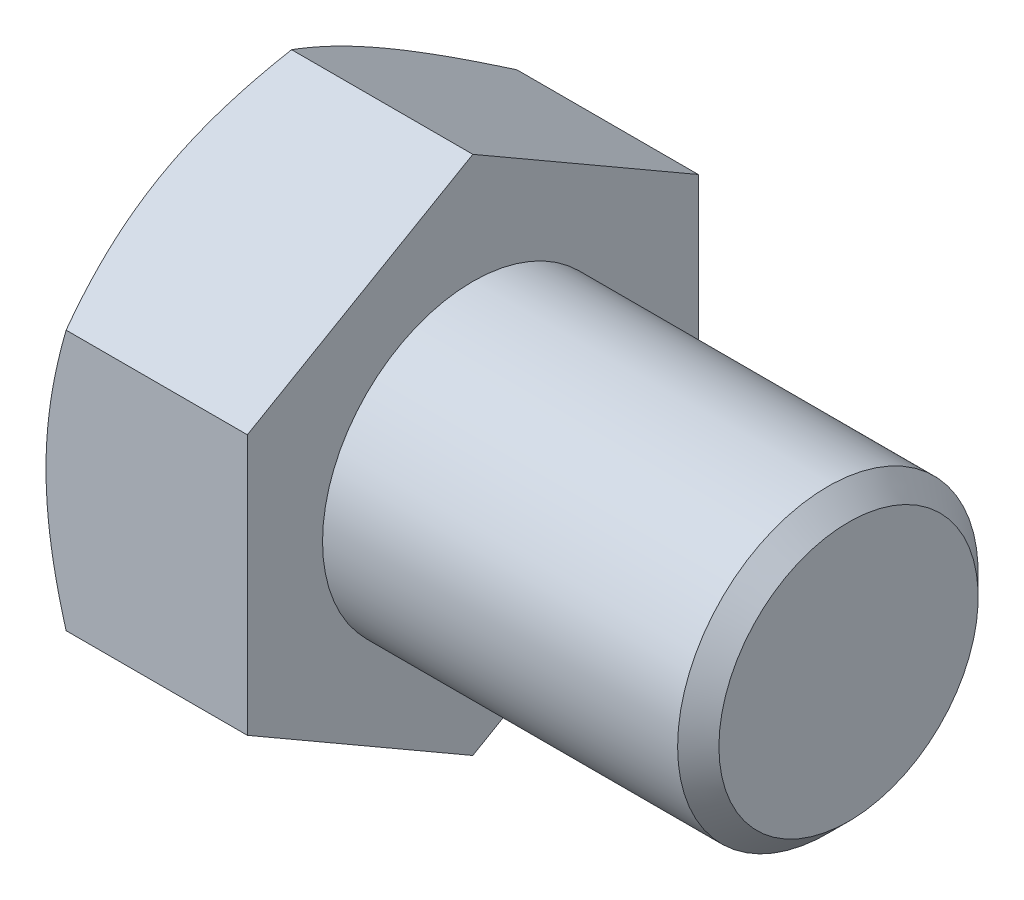
ISO-10303-21;
HEADER;
FILE_DESCRIPTION(('STEP AP214'),'2;1');
FILE_NAME('part.step','',(''),(''),'','','');
FILE_SCHEMA(('AUTOMOTIVE_DESIGN { 1 0 10303 214 1 1 1 1 }'));
ENDSEC;
DATA;
#1=APPLICATION_CONTEXT('core data for automotive mechanical design processes');
#2=APPLICATION_PROTOCOL_DEFINITION('international standard','automotive_design',2000,#1);
#3=PRODUCT_CONTEXT('',#1,'mechanical');
#4=PRODUCT('Part','Part','',(#3));
#5=PRODUCT_RELATED_PRODUCT_CATEGORY('part','',(#4));
#6=PRODUCT_DEFINITION_FORMATION('','',#4);
#7=PRODUCT_DEFINITION_CONTEXT('part definition',#1,'design');
#8=PRODUCT_DEFINITION('design','',#6,#7);
#9=PRODUCT_DEFINITION_SHAPE('','',#8);
#10=(LENGTH_UNIT() NAMED_UNIT(*) SI_UNIT(.MILLI.,.METRE.));
#11=(NAMED_UNIT(*) PLANE_ANGLE_UNIT() SI_UNIT($,.RADIAN.));
#12=(NAMED_UNIT(*) SI_UNIT($,.STERADIAN.) SOLID_ANGLE_UNIT());
#13=UNCERTAINTY_MEASURE_WITH_UNIT(LENGTH_MEASURE(1.E-05),#10,'distance_accuracy_value','');
#14=(GEOMETRIC_REPRESENTATION_CONTEXT(3) GLOBAL_UNCERTAINTY_ASSIGNED_CONTEXT((#13)) GLOBAL_UNIT_ASSIGNED_CONTEXT((#10,
#11,#12)) REPRESENTATION_CONTEXT('',''));
#15=CARTESIAN_POINT('',(0.,0.,0.));
#16=DIRECTION('',(0.,0.,1.));
#17=DIRECTION('',(1.,0.,0.));
#18=AXIS2_PLACEMENT_3D('',#15,#16,#17);
#19=CARTESIAN_POINT('',(13.3999999999959,8.66025403784447,-15.0000000000012));
#20=DIRECTION('',(0.,-0.866025403784436,0.500000000000001));
#21=DIRECTION('',(0.,-0.500000000000001,-0.866025403784436));
#22=AXIS2_PLACEMENT_3D('',#19,#20,#21);
#23=PLANE('',#22);
#24=CARTESIAN_POINT('',(1.33981262949145,17.3206235457429,0.00019999999800735));
#25=CARTESIAN_POINT('',(1.22992178974495,17.1302745659133,-0.329494104235164));
#26=CARTESIAN_POINT('',(1.12501758932902,16.9391831227823,-0.660474192629355));
#27=CARTESIAN_POINT('',(0.926568581943113,16.5554679079495,-1.32508844035675));
#28=CARTESIAN_POINT('',(0.833027511049702,16.3628436543365,-1.65872343438453));
#29=CARTESIAN_POINT('',(0.658562147610224,15.9756905506628,-2.32929228025546));
#30=CARTESIAN_POINT('',(0.577667706602513,15.7811583127516,-2.66623200002775));
#31=CARTESIAN_POINT('',(0.430232643422329,15.3907420734257,-3.34245276264016));
#32=CARTESIAN_POINT('',(0.36369120238161,15.1948581497858,-3.68173367077032));
#33=CARTESIAN_POINT('',(0.247792374696675,14.8067578304071,-4.35394314236808));
#34=CARTESIAN_POINT('',(0.198051383437111,14.6145702475693,-4.68682180042704));
#35=CARTESIAN_POINT('',(0.114646749003904,14.229314441666,-5.35410443016227));
#36=CARTESIAN_POINT('',(0.0809834152901584,14.0362462017221,-5.68850843107301));
#37=CARTESIAN_POINT('',(0.0305840757088134,13.6497853945799,-6.3578781841776));
#38=CARTESIAN_POINT('',(0.0138279549596573,13.4563934876208,-6.69284279280379));
#39=CARTESIAN_POINT('',(-0.00239660617380265,13.0694311550729,-7.36308121339096));
#40=CARTESIAN_POINT('',(-0.00186558073162809,12.8758607351851,-7.69835501547773));
#41=CARTESIAN_POINT('',(0.0152766129945827,12.5139822792561,-8.32514688731148));
#42=CARTESIAN_POINT('',(0.0297968460483135,12.3456484541483,-8.6167096250319));
#43=CARTESIAN_POINT('',(0.0716371404238038,12.0093680110874,-9.1991644380061));
#44=CARTESIAN_POINT('',(0.0989581071100801,11.841421421367,-9.49005646435947));
#45=CARTESIAN_POINT('',(0.165923511998926,11.5060066717832,-10.0710118522462));
#46=CARTESIAN_POINT('',(0.205578128270891,11.338539022768,-10.3610743289648));
#47=CARTESIAN_POINT('',(0.296515103018264,11.0043888432053,-10.9398394173258));
#48=CARTESIAN_POINT('',(0.347798251969543,10.8377063668183,-11.2285419351594));
#49=CARTESIAN_POINT('',(0.520386864747446,10.3317324659538,-12.1049144387605));
#50=CARTESIAN_POINT('',(0.658901178257684,9.9939062555909,-12.6900465992375));
#51=CARTESIAN_POINT('',(0.973271968475243,9.32329122184555,-13.851585910004));
#52=CARTESIAN_POINT('',(1.14905461461676,8.99049381241429,-14.4280079317664));
#53=CARTESIAN_POINT('',(1.33981262948479,8.6601385677906,-15.0002000000018));
#54=B_SPLINE_CURVE_WITH_KNOTS('',3,(#24,#25,#26,#27,#28,#29,#30,#31,#32,#33,#34,#35,#36,#37,#38,
#39,#40,#41,#42,#43,#44,#45,#46,#47,#48,#49,#50,#51,#52,#53),.UNSPECIFIED.,.F.,.F.,(4,2,2,2,2,2,
2,2,2,2,2,2,2,2,4),(0.,1.18875411504131,2.377898028,3.56980778300347,4.76164951910096,
5.92407379683694,7.08652044780734,8.24758247405967,9.40860862348214,10.4193068498549,
11.4300765712295,12.4416826308638,13.4533574773395,15.5211962051179,17.5849760846236),.UNSPECIFIED.);
#55=CARTESIAN_POINT('',(1.33974596215847,17.3205080756889,-1.60982338570648E-12));
#56=VERTEX_POINT('',#55);
#57=CARTESIAN_POINT('',(-3.99680288865056E-12,12.9903810567665,-7.50000000000012));
#58=VERTEX_POINT('',#57);
#59=EDGE_CURVE('E62',#56,#58,#54,.T.);
#60=ORIENTED_EDGE('',*,*,#59,.F.);
#61=DIRECTION('',(-1.,0.,0.));
#62=VECTOR('',#61,1.);
#63=CARTESIAN_POINT('',(13.4000000000025,17.320508075689,-1.0547118733939E-12));
#64=LINE('',#63,#62);
#65=CARTESIAN_POINT('',(13.4000000000025,17.320508075689,-1.0547118733939E-12));
#66=VERTEX_POINT('',#65);
#67=EDGE_CURVE('E158',#66,#56,#64,.T.);
#68=ORIENTED_EDGE('',*,*,#67,.F.);
#69=DIRECTION('',(0.,0.500000000000001,0.866025403784436));
#70=VECTOR('',#69,1.);
#71=CARTESIAN_POINT('',(13.3999999999959,8.66025403784447,-15.0000000000012));
#72=LINE('',#71,#70);
#73=CARTESIAN_POINT('',(13.3999999999959,8.66025403784447,-15.0000000000012));
#74=VERTEX_POINT('',#73);
#75=EDGE_CURVE('E249',#74,#66,#72,.T.);
#76=ORIENTED_EDGE('',*,*,#75,.F.);
#77=DIRECTION('',(-1.,0.,0.));
#78=VECTOR('',#77,1.);
#79=CARTESIAN_POINT('',(13.3999999999959,8.66025403784447,-15.0000000000012));
#80=LINE('',#79,#78);
#81=CARTESIAN_POINT('',(1.33974596215181,8.66025403784453,-15.0000000000015));
#82=VERTEX_POINT('',#81);
#83=EDGE_CURVE('E146',#74,#82,#80,.T.);
#84=ORIENTED_EDGE('',*,*,#83,.T.);
#85=EDGE_CURVE('E140',#58,#82,#54,.T.);
#86=ORIENTED_EDGE('',*,*,#85,.F.);
#87=EDGE_LOOP('',(#60,#68,#76,#84,#86));
#88=FACE_BOUND('',#87,.T.);
#89=ADVANCED_FACE('F46',(#88),#23,.F.);
#90=CARTESIAN_POINT('',(13.4000000000025,17.320508075689,-1.0547118733939E-12));
#91=DIRECTION('',(0.,-0.866025403784438,-0.500000000000001));
#92=DIRECTION('',(0.,0.500000000000001,-0.866025403784438));
#93=AXIS2_PLACEMENT_3D('',#90,#91,#92);
#94=PLANE('',#93);
#95=CARTESIAN_POINT('',(1.33981262948879,8.66013856779067,15.0001999999982));
#96=CARTESIAN_POINT('',(1.22992178974352,8.85048754762046,14.6705058957646));
#97=CARTESIAN_POINT('',(1.12501758932809,9.04157899075148,14.3395258073703));
#98=CARTESIAN_POINT('',(0.926568581942536,9.42529420558436,13.6749115596427));
#99=CARTESIAN_POINT('',(0.833027511048978,9.61791845919735,13.3412765656149));
#100=CARTESIAN_POINT('',(0.658562147609391,10.0050715628711,12.6707077197439));
#101=CARTESIAN_POINT('',(0.577667706601716,10.1996038007823,12.3337679999716));
#102=CARTESIAN_POINT('',(0.430232643421567,10.5900200401083,11.6575472373591));
#103=CARTESIAN_POINT('',(0.363691202380847,10.7859039637481,11.3182663292289));
#104=CARTESIAN_POINT('',(0.247792374695915,11.1740042831269,10.6460568576312));
#105=CARTESIAN_POINT('',(0.198051383436355,11.3661918659648,10.3131781995722));
#106=CARTESIAN_POINT('',(0.114646749003198,11.751447671868,9.64589556983693));
#107=CARTESIAN_POINT('',(0.0809834152894975,11.9445159118119,9.31149156892617));
#108=CARTESIAN_POINT('',(0.0305840757080926,12.3309767189542,8.64212181582161));
#109=CARTESIAN_POINT('',(0.0138279549588316,12.5243686259134,8.30715720719547));
#110=CARTESIAN_POINT('',(-0.0023966061742602,12.911330958461,7.63691878660807));
#111=CARTESIAN_POINT('',(-0.00186558073161222,13.1049013783484,7.30164498452102));
#112=CARTESIAN_POINT('',(0.0152766129945689,13.4667798342774,6.67485311268725));
#113=CARTESIAN_POINT('',(0.0297968460479151,13.6351136593857,6.38329037496703));
#114=CARTESIAN_POINT('',(0.0716371404231525,13.9713941024469,5.80083556199295));
#115=CARTESIAN_POINT('',(0.09895810710956,14.1393406921672,5.50994353563951));
#116=CARTESIAN_POINT('',(0.165923511998519,14.4747554417509,4.9289881477527));
#117=CARTESIAN_POINT('',(0.205578128270465,14.6422230907662,4.6389256710341));
#118=CARTESIAN_POINT('',(0.296515103017885,14.9763732703289,4.06016058267315));
#119=CARTESIAN_POINT('',(0.347798251969229,15.1430557467158,3.7714580648396));
#120=CARTESIAN_POINT('',(0.520386864747046,15.6490296475804,2.89508556123841));
#121=CARTESIAN_POINT('',(0.658901178256827,15.9868558579434,2.30995340076128));
#122=CARTESIAN_POINT('',(0.973271968475716,16.6574708916886,1.14841408999487));
#123=CARTESIAN_POINT('',(1.14905461461902,16.9902683011197,0.571992068232795));
#124=CARTESIAN_POINT('',(1.33981262949145,17.3206235457429,-0.000200000001671086));
#125=B_SPLINE_CURVE_WITH_KNOTS('',3,(#95,#96,#97,#98,#99,#100,#101,#102,#103,#104,#105,#106,
#107,#108,#109,#110,#111,#112,#113,#114,#115,#116,#117,#118,#119,#120,#121,#122,#123,#124),
.UNSPECIFIED.,.F.,.F.,(4,2,2,2,2,2,2,2,2,2,2,2,2,2,4),(0.,1.18875411504146,2.3778980280003,
3.56980778300386,4.76164951910144,5.92407379683745,7.08652044780786,8.24758247406025,
9.4086086234828,10.4193068498556,11.4300765712303,12.4416826308645,13.4533574773402,
15.5211962051188,17.5849760846249),.UNSPECIFIED.);
#126=CARTESIAN_POINT('',(1.3397459621558,8.66025403784458,14.9999999999984));
#127=VERTEX_POINT('',#126);
#128=CARTESIAN_POINT('',(0.,12.9903810567665,7.49999999999973));
#129=VERTEX_POINT('',#128);
#130=EDGE_CURVE('E69',#127,#129,#125,.T.);
#131=ORIENTED_EDGE('',*,*,#130,.F.);
#132=DIRECTION('',(-1.,0.,0.));
#133=VECTOR('',#132,1.);
#134=CARTESIAN_POINT('',(13.3999999999999,8.66025403784466,14.9999999999993));
#135=LINE('',#134,#133);
#136=CARTESIAN_POINT('',(13.3999999999999,8.66025403784466,14.9999999999993));
#137=VERTEX_POINT('',#136);
#138=EDGE_CURVE('E156',#137,#127,#135,.T.);
#139=ORIENTED_EDGE('',*,*,#138,.F.);
#140=DIRECTION('',(0.,-0.500000000000001,0.866025403784438));
#141=VECTOR('',#140,1.);
#142=CARTESIAN_POINT('',(13.4000000000025,17.320508075689,-1.0547118733939E-12));
#143=LINE('',#142,#141);
#144=EDGE_CURVE('E247',#66,#137,#143,.T.);
#145=ORIENTED_EDGE('',*,*,#144,.F.);
#146=ORIENTED_EDGE('',*,*,#67,.T.);
#147=EDGE_CURVE('E173',#129,#56,#125,.T.);
#148=ORIENTED_EDGE('',*,*,#147,.F.);
#149=EDGE_LOOP('',(#131,#139,#145,#146,#148));
#150=FACE_BOUND('',#149,.T.);
#151=ADVANCED_FACE('F179',(#150),#94,.F.);
#152=CARTESIAN_POINT('',(13.3999999999999,8.66025403784466,14.9999999999993));
#153=DIRECTION('',(0.,0.,-1.));
#154=DIRECTION('',(-1.,0.,0.));
#155=AXIS2_PLACEMENT_3D('',#152,#153,#154);
#156=PLANE('',#155);
#157=CARTESIAN_POINT('',(7.37312634053033,-23.3710902414275,14.9999999999986));
#158=CARTESIAN_POINT('',(7.2137526215236,-23.0430760678899,14.999999999999));
#159=CARTESIAN_POINT('',(7.05516543980331,-22.7146799160127,14.9999999999992));
#160=CARTESIAN_POINT('',(6.73974206910379,-22.05704398432,14.9999999999994));
#161=CARTESIAN_POINT('',(6.58290589740235,-21.7278041962194,14.9999999999993));
#162=CARTESIAN_POINT('',(6.11525014240026,-20.7386136963535,14.9999999999992));
#163=CARTESIAN_POINT('',(5.80732977355088,-20.0772871992665,14.9999999999993));
#164=CARTESIAN_POINT('',(5.19942692960361,-18.7466975896985,14.9999999999993));
#165=CARTESIAN_POINT('',(4.89949586067152,-18.0774109356538,14.9999999999993));
#166=CARTESIAN_POINT('',(4.3117582823937,-16.7335531318988,14.9999999999993));
#167=CARTESIAN_POINT('',(4.02395120754568,-16.0589822304074,14.9999999999993));
#168=CARTESIAN_POINT('',(3.45448123485085,-14.6812618339694,14.9999999999993));
#169=CARTESIAN_POINT('',(3.17332879633735,-13.9779002509552,14.9999999999993));
#170=CARTESIAN_POINT('',(2.63203971808663,-12.5629833856314,14.9999999999993));
#171=CARTESIAN_POINT('',(2.37190542191437,-11.8514271996858,14.9999999999994));
#172=CARTESIAN_POINT('',(1.87940642767847,-10.4203092774281,14.9999999999992));
#173=CARTESIAN_POINT('',(1.64698643343642,-9.70076672295575,14.9999999999988));
#174=CARTESIAN_POINT('',(1.21728875041617,-8.25129237856194,14.9999999999998));
#175=CARTESIAN_POINT('',(1.02000010663817,-7.52136390422092,15.000000000001));
#176=CARTESIAN_POINT('',(0.758044011051221,-6.42057854312759,15.0000000000003));
#177=CARTESIAN_POINT('',(0.676568269150707,-6.05369801817304,14.9999999999996));
#178=CARTESIAN_POINT('',(0.525901265984167,-5.31741005067913,14.999999999999));
#179=CARTESIAN_POINT('',(0.456709757583278,-4.94800265913072,14.9999999999992));
#180=CARTESIAN_POINT('',(0.331825651240384,-4.20690684288065,14.9999999999994));
#181=CARTESIAN_POINT('',(0.276132866036205,-3.83521844989572,14.9999999999993));
#182=CARTESIAN_POINT('',(0.179353464527608,-3.08994807492367,14.9999999999993));
#183=CARTESIAN_POINT('',(0.138266210271655,-2.71636617636563,14.9999999999993));
#184=CARTESIAN_POINT('',(0.0720349282965913,-1.97275308863384,14.9999999999993));
#185=CARTESIAN_POINT('',(0.0466876247898137,-1.60274011631211,14.9999999999993));
#186=CARTESIAN_POINT('',(0.0116690165589467,-0.861974179459193,14.9999999999993));
#187=CARTESIAN_POINT('',(0.00199744875057519,-0.491221227451583,14.9999999999993));
#188=CARTESIAN_POINT('',(-0.00143922526280585,0.250361887880328,14.9999999999992));
#189=CARTESIAN_POINT('',(0.00479570856969709,0.621192051396623,14.9999999999991));
#190=CARTESIAN_POINT('',(0.0330186069485821,1.36225664168384,14.9999999999995));
#191=CARTESIAN_POINT('',(0.0550072762400003,1.73249104106054,15.));
#192=CARTESIAN_POINT('',(0.126051291967395,2.61901692241343,15.0000000000003));
#193=CARTESIAN_POINT('',(0.182399811188253,3.13473445335257,14.9999999999996));
#194=CARTESIAN_POINT('',(0.322620708609686,4.16241630599156,14.999999999999));
#195=CARTESIAN_POINT('',(0.406496739203871,4.67438012042198,14.9999999999992));
#196=CARTESIAN_POINT('',(0.598789077162155,5.69404144057643,14.9999999999994));
#197=CARTESIAN_POINT('',(0.70722421073915,6.20173536185491,14.9999999999993));
#198=CARTESIAN_POINT('',(0.945319561804376,7.2120668323238,14.9999999999993));
#199=CARTESIAN_POINT('',(1.07497948282535,7.7147044520364,14.9999999999993));
#200=CARTESIAN_POINT('',(1.35544197251151,8.72602999971862,14.9999999999993));
#201=CARTESIAN_POINT('',(1.50664978204951,9.23460476162545,14.9999999999993));
#202=CARTESIAN_POINT('',(1.82490436710128,10.2467458696593,14.9999999999993));
#203=CARTESIAN_POINT('',(1.99195124812721,10.7503121823977,14.9999999999992));
#204=CARTESIAN_POINT('',(2.33921280433556,11.7526813548355,14.9999999999994));
#205=CARTESIAN_POINT('',(2.51942324274063,12.2514856892744,14.9999999999995));
#206=CARTESIAN_POINT('',(2.89087066917173,13.2449469437037,14.9999999999991));
#207=CARTESIAN_POINT('',(3.08210752155896,13.7396039146263,14.9999999999985));
#208=CARTESIAN_POINT('',(3.54947439299904,14.9157121538862,14.9999999999982));
#209=CARTESIAN_POINT('',(3.82985053968005,15.5954736257746,14.999999999999));
#210=CARTESIAN_POINT('',(4.40448813553263,16.9491200475868,14.9999999999996));
#211=CARTESIAN_POINT('',(4.69875048752325,17.6230046120362,14.9999999999994));
#212=CARTESIAN_POINT('',(5.2983523129537,18.9660045563959,14.9999999999992));
#213=CARTESIAN_POINT('',(5.60369438024245,19.6351187750887,14.9999999999993));
#214=CARTESIAN_POINT('',(6.22319663096821,20.9692236108892,14.9999999999993));
#215=CARTESIAN_POINT('',(6.53735661507852,21.6342143207936,14.9999999999993));
#216=CARTESIAN_POINT('',(7.17319119707159,22.9615174098263,14.9999999999993));
#217=CARTESIAN_POINT('',(7.4948739360652,23.6238258820834,14.9999999999993));
#218=CARTESIAN_POINT('',(8.14411318318141,24.9455571746817,14.9999999999993));
#219=CARTESIAN_POINT('',(8.47166971805678,25.6049799818627,14.9999999999993));
#220=CARTESIAN_POINT('',(9.13159579124988,26.9212980535411,14.9999999999993));
#221=CARTESIAN_POINT('',(9.46396466906465,27.5781936495281,14.9999999999993));
#222=CARTESIAN_POINT('',(10.1327647289833,28.8899147664244,14.9999999999993));
#223=CARTESIAN_POINT('',(10.4691959273164,29.5447402790504,14.9999999999993));
#224=CARTESIAN_POINT('',(11.4259204894654,31.3950227179767,14.9999999999993));
#225=CARTESIAN_POINT('',(12.0502117945664,32.5884123624247,14.9999999999993));
#226=CARTESIAN_POINT('',(13.3073006196974,34.970749109484,14.9999999999993));
#227=CARTESIAN_POINT('',(13.9400984560095,36.1596960447985,14.9999999999993));
#228=CARTESIAN_POINT('',(15.2105565660844,38.531046356627,14.9999999999993));
#229=CARTESIAN_POINT('',(15.8482001148671,39.713458699775,14.9999999999993));
#230=CARTESIAN_POINT('',(16.8084387500316,41.4849860590732,14.9999999999993));
#231=CARTESIAN_POINT('',(17.129138143899,42.0751301506575,14.9999999999993));
#232=CARTESIAN_POINT('',(17.7716684878245,43.2548008777467,14.9999999999993));
#233=CARTESIAN_POINT('',(18.0934994361267,43.844327514208,14.9999999999994));
#234=CARTESIAN_POINT('',(18.4158306344155,44.4335805842629,14.9999999999996));
#235=B_SPLINE_CURVE_WITH_KNOTS('',3,(#157,#158,#159,#160,#161,#162,#163,#164,#165,#166,#167,
#168,#169,#170,#171,#172,#173,#174,#175,#176,#177,#178,#179,#180,#181,#182,#183,#184,#185,#186,
#187,#188,#189,#190,#191,#192,#193,#194,#195,#196,#197,#198,#199,#200,#201,#202,#203,#204,#205,
#206,#207,#208,#209,#210,#211,#212,#213,#214,#215,#216,#217,#218,#219,#220,#221,#222,#223,#224,
#225,#226,#227,#228,#229,#230,#231,#232,#233,#234),.UNSPECIFIED.,.F.,.F.,(4,2,2,2,2,2,2,2,2,2,2,
2,2,2,2,2,2,2,2,2,2,2,2,2,2,2,2,2,2,2,2,2,2,2,2,2,2,2,4),(0.,1.09404536545603,2.18810151669502,
4.37653199497436,6.57669491913782,8.77675510670035,11.0489153517506,13.3213285985884,
15.5891291968648,17.8562213843684,18.9835047903021,20.110765514918,21.2380106006194,
22.3652064435975,23.4775244969856,24.5898238822594,25.7021260672527,26.8144780143102,
28.3699800813119,29.9256886182745,31.482593771755,33.0394771802814,34.6309007054006,
36.2223348325514,37.8132589841612,39.4041635695719,41.6098943752715,43.8157687858481,
46.0221629836906,48.228507346673,50.4373613391618,52.646225394645,54.8547891004877,
57.0633616326593,61.1037632903605,65.1443155923788,69.1744593139778,71.1894182888202,
73.2043741379867),.UNSPECIFIED.);
#236=CARTESIAN_POINT('',(1.33974596215847,-8.66025403784425,14.9999999999981));
#237=VERTEX_POINT('',#236);
#238=CARTESIAN_POINT('',(0.,0.,14.9999999999998));
#239=VERTEX_POINT('',#238);
#240=EDGE_CURVE('E259',#237,#239,#235,.T.);
#241=ORIENTED_EDGE('',*,*,#240,.F.);
#242=DIRECTION('',(-1.,0.,0.));
#243=VECTOR('',#242,1.);
#244=CARTESIAN_POINT('',(13.4000000000025,-8.66025403784409,14.999999999999));
#245=LINE('',#244,#243);
#246=CARTESIAN_POINT('',(13.4000000000025,-8.66025403784409,14.999999999999));
#247=VERTEX_POINT('',#246);
#248=EDGE_CURVE('E148',#247,#237,#245,.T.);
#249=ORIENTED_EDGE('',*,*,#248,.F.);
#250=DIRECTION('',(0.,-1.,0.));
#251=VECTOR('',#250,1.);
#252=CARTESIAN_POINT('',(13.3999999999999,8.66025403784466,14.9999999999993));
#253=LINE('',#252,#251);
#254=EDGE_CURVE('E243',#137,#247,#253,.T.);
#255=ORIENTED_EDGE('',*,*,#254,.F.);
#256=ORIENTED_EDGE('',*,*,#138,.T.);
#257=EDGE_CURVE('E197',#239,#127,#235,.T.);
#258=ORIENTED_EDGE('',*,*,#257,.F.);
#259=EDGE_LOOP('',(#241,#249,#255,#256,#258));
#260=FACE_BOUND('',#259,.T.);
#261=ADVANCED_FACE('F265',(#260),#156,.F.);
#262=CARTESIAN_POINT('',(13.3999999999959,-17.3205080756885,-1.0547118733939E-12));
#263=DIRECTION('',(0.,0.866025403784437,-0.500000000000001));
#264=DIRECTION('',(0.,0.500000000000001,0.866025403784437));
#265=AXIS2_PLACEMENT_3D('',#262,#263,#264);
#266=PLANE('',#265);
#267=CARTESIAN_POINT('',(1.33981262948479,-17.3206235457427,-0.000200000001504552));
#268=CARTESIAN_POINT('',(1.22992178974225,-17.1302745659127,0.329494104232835));
#269=CARTESIAN_POINT('',(1.12501758932792,-16.9391831227816,0.660474192627559));
#270=CARTESIAN_POINT('',(0.926568581943136,-16.5554679079486,1.32508844035544));
#271=CARTESIAN_POINT('',(0.833027511049248,-16.3628436543356,1.65872343438316));
#272=CARTESIAN_POINT('',(0.658562147609419,-15.9756905506619,2.32929228025397));
#273=CARTESIAN_POINT('',(0.577667706601826,-15.7811583127507,2.6662320000262));
#274=CARTESIAN_POINT('',(0.430232643421755,-15.3907420734249,3.34245276263845));
#275=CARTESIAN_POINT('',(0.363691202381031,-15.1948581497852,3.68173367076852));
#276=CARTESIAN_POINT('',(0.247792374695941,-14.8067578304064,4.35394314236627));
#277=CARTESIAN_POINT('',(0.198051383436238,-14.6145702475685,4.68682180042532));
#278=CARTESIAN_POINT('',(0.114646749003293,-14.2293144416652,5.35410443016071));
#279=CARTESIAN_POINT('',(0.0809834152899437,-14.0362462017213,5.68850843107152));
#280=CARTESIAN_POINT('',(0.0305840757074062,-13.6497853945788,6.35787818417618));
#281=CARTESIAN_POINT('',(0.0138279549566678,-13.4563934876193,6.69284279280236));
#282=CARTESIAN_POINT('',(-0.00239660617253266,-13.0694311550721,7.36308121339031));
#283=CARTESIAN_POINT('',(-0.00186558072451186,-12.8758607351852,7.69835501547786));
#284=CARTESIAN_POINT('',(0.0152766130008447,-12.5139822792558,8.32514688731197));
#285=CARTESIAN_POINT('',(0.0297968460493957,-12.3456484541469,8.61670962503208));
#286=CARTESIAN_POINT('',(0.071637140421117,-12.0093680110852,9.19916443800606));
#287=CARTESIAN_POINT('',(0.0989581071088001,-11.8414214213651,9.49005646435951));
#288=CARTESIAN_POINT('',(0.16592351199868,-11.5060066717816,10.0710118522463));
#289=CARTESIAN_POINT('',(0.205578128270269,-11.3385390227663,10.3610743289648));
#290=CARTESIAN_POINT('',(0.296515103017398,-11.0043888432036,10.9398394173256));
#291=CARTESIAN_POINT('',(0.347798251968807,-10.8377063668167,11.2285419351591));
#292=CARTESIAN_POINT('',(0.520386864746618,-10.3317324659525,12.1049144387598));
#293=CARTESIAN_POINT('',(0.658901178256146,-9.99390625558977,12.6900465992366));
#294=CARTESIAN_POINT('',(0.973271968474899,-9.32329122184471,13.8515859100023));
#295=CARTESIAN_POINT('',(1.14905461461833,-8.99049381241358,14.4280079317641));
#296=CARTESIAN_POINT('',(1.33981262949145,-8.66013856779022,15.0001999999981));
#297=B_SPLINE_CURVE_WITH_KNOTS('',3,(#267,#268,#269,#270,#271,#272,#273,#274,#275,#276,#277,
#278,#279,#280,#281,#282,#283,#284,#285,#286,#287,#288,#289,#290,#291,#292,#293,#294,#295,#296),
.UNSPECIFIED.,.F.,.F.,(4,2,2,2,2,2,2,2,2,2,2,2,2,2,4),(0.,1.18875411504165,2.37789802800059,
3.56980778300372,4.76164951910092,5.92407379683723,7.08652044780777,8.24758247406058,
9.40860862348385,10.4193068498569,11.4300765712314,12.4416826308655,13.4533574773409,
15.5211962051181,17.5849760846236),.UNSPECIFIED.);
#298=CARTESIAN_POINT('',(1.33974596215181,-17.3205080756887,-2.05391259555654E-12));
#299=VERTEX_POINT('',#298);
#300=CARTESIAN_POINT('',(2.66453525910038E-12,-12.9903810567664,7.49999999999929));
#301=VERTEX_POINT('',#300);
#302=EDGE_CURVE('E181',#299,#301,#297,.T.);
#303=ORIENTED_EDGE('',*,*,#302,.F.);
#304=DIRECTION('',(-1.,0.,0.));
#305=VECTOR('',#304,1.);
#306=CARTESIAN_POINT('',(13.3999999999959,-17.3205080756885,-1.0547118733939E-12));
#307=LINE('',#306,#305);
#308=CARTESIAN_POINT('',(13.3999999999959,-17.3205080756885,-1.0547118733939E-12));
#309=VERTEX_POINT('',#308);
#310=EDGE_CURVE('E145',#309,#299,#307,.T.);
#311=ORIENTED_EDGE('',*,*,#310,.F.);
#312=DIRECTION('',(0.,-0.500000000000001,-0.866025403784437));
#313=VECTOR('',#312,1.);
#314=CARTESIAN_POINT('',(13.3999999999959,-17.3205080756885,-1.0547118733939E-12));
#315=LINE('',#314,#313);
#316=EDGE_CURVE('E241',#247,#309,#315,.T.);
#317=ORIENTED_EDGE('',*,*,#316,.F.);
#318=ORIENTED_EDGE('',*,*,#248,.T.);
#319=EDGE_CURVE('E183',#301,#237,#297,.T.);
#320=ORIENTED_EDGE('',*,*,#319,.F.);
#321=EDGE_LOOP('',(#303,#311,#317,#318,#320));
#322=FACE_BOUND('',#321,.T.);
#323=ADVANCED_FACE('F237',(#322),#266,.F.);
#324=CARTESIAN_POINT('',(13.3999999999999,-8.6602540378443,-15.000000000001));
#325=DIRECTION('',(0.,0.866025403784437,0.5));
#326=DIRECTION('',(0.,-0.5,0.866025403784437));
#327=AXIS2_PLACEMENT_3D('',#324,#325,#326);
#328=PLANE('',#327);
#329=CARTESIAN_POINT('',(1.33981262948879,-8.6601385677903,-15.0002000000007));
#330=CARTESIAN_POINT('',(1.22992178974414,-8.85048754762011,-14.670505895767));
#331=CARTESIAN_POINT('',(1.12501758932895,-9.04157899075116,-14.3395258073725));
#332=CARTESIAN_POINT('',(0.92656858194355,-9.42529420558406,-13.6749115596448));
#333=CARTESIAN_POINT('',(0.8330275110499,-9.61791845919705,-13.341276565617));
#334=CARTESIAN_POINT('',(0.658562147610232,-10.0050715628708,-12.6707077197461));
#335=CARTESIAN_POINT('',(0.577667706602566,-10.199603800782,-12.3337679999738));
#336=CARTESIAN_POINT('',(0.430232643422416,-10.5900200401079,-11.6575472373614));
#337=CARTESIAN_POINT('',(0.363691202381687,-10.7859039637477,-11.3182663292313));
#338=CARTESIAN_POINT('',(0.247792374696647,-11.1740042831265,-10.6460568576335));
#339=CARTESIAN_POINT('',(0.198051383436995,-11.3661918659644,-10.3131781995744));
#340=CARTESIAN_POINT('',(0.114646749003914,-11.7514476718677,-9.64589556983902));
#341=CARTESIAN_POINT('',(0.08098341529038,-11.9445159118116,-9.31149156892818));
#342=CARTESIAN_POINT('',(0.030584075708369,-12.3309767189541,-8.6421218158235));
#343=CARTESIAN_POINT('',(0.0138279549583382,-12.5243686259135,-8.30715720719732));
#344=CARTESIAN_POINT('',(-0.00239660617277822,-12.9113309584609,-7.63691878660952));
#345=CARTESIAN_POINT('',(-0.00186558072738312,-13.1049013783479,-7.30164498452212));
#346=CARTESIAN_POINT('',(0.0152766129983591,-13.4667798342772,-6.67485311268821));
#347=CARTESIAN_POINT('',(0.0297968460492338,-13.6351136593858,-6.38329037496816));
#348=CARTESIAN_POINT('',(0.071637140422636,-13.9713941024472,-5.80083556199429));
#349=CARTESIAN_POINT('',(0.0989581071096782,-14.1393406921674,-5.50994353564089));
#350=CARTESIAN_POINT('',(0.165923511999077,-14.4747554417509,-4.92898814775421));
#351=CARTESIAN_POINT('',(0.205578128270828,-14.6422230907662,-4.6389256710357));
#352=CARTESIAN_POINT('',(0.296515103018021,-14.9763732703288,-4.06016058267492));
#353=CARTESIAN_POINT('',(0.347798251969334,-15.1430557467157,-3.77145806484146));
#354=CARTESIAN_POINT('',(0.520386864747209,-15.6490296475799,-2.89508556124076));
#355=CARTESIAN_POINT('',(0.658901178257266,-15.9868558579426,-2.3099534007641));
#356=CARTESIAN_POINT('',(0.973271968474713,-16.6574708916877,-1.1484140899981));
#357=CARTESIAN_POINT('',(1.14905461461631,-16.9902683011189,-0.571992068235961));
#358=CARTESIAN_POINT('',(1.33981262948479,-17.3206235457425,0.000199999999062062));
#359=B_SPLINE_CURVE_WITH_KNOTS('',3,(#329,#330,#331,#332,#333,#334,#335,#336,#337,#338,#339,
#340,#341,#342,#343,#344,#345,#346,#347,#348,#349,#350,#351,#352,#353,#354,#355,#356,#357,#358),
.UNSPECIFIED.,.F.,.F.,(4,2,2,2,2,2,2,2,2,2,2,2,2,2,4),(0.,1.18875411504158,2.37789802800048,
3.56980778300386,4.76164951910128,5.92407379683761,7.08652044780824,8.24758247406098,
9.40860862348404,10.4193068498567,11.4300765712311,12.4416826308651,13.4533574773405,
15.5211962051177,17.5849760846228),.UNSPECIFIED.);
#360=CARTESIAN_POINT('',(1.3397459621558,-8.66025403784427,-15.0000000000015));
#361=VERTEX_POINT('',#360);
#362=CARTESIAN_POINT('',(0.,-12.9903810567664,-7.49999999999979));
#363=VERTEX_POINT('',#362);
#364=EDGE_CURVE('E122',#361,#363,#359,.T.);
#365=ORIENTED_EDGE('',*,*,#364,.F.);
#366=DIRECTION('',(-1.,0.,0.));
#367=VECTOR('',#366,1.);
#368=CARTESIAN_POINT('',(13.3999999999999,-8.6602540378443,-15.000000000001));
#369=LINE('',#368,#367);
#370=CARTESIAN_POINT('',(13.3999999999999,-8.6602540378443,-15.000000000001));
#371=VERTEX_POINT('',#370);
#372=EDGE_CURVE('E136',#371,#361,#369,.T.);
#373=ORIENTED_EDGE('',*,*,#372,.F.);
#374=DIRECTION('',(0.,0.500000000000001,-0.866025403784438));
#375=VECTOR('',#374,1.);
#376=CARTESIAN_POINT('',(13.3999999999999,-8.6602540378443,-15.000000000001));
#377=LINE('',#376,#375);
#378=EDGE_CURVE('E239',#309,#371,#377,.T.);
#379=ORIENTED_EDGE('',*,*,#378,.F.);
#380=ORIENTED_EDGE('',*,*,#310,.T.);
#381=EDGE_CURVE('E139',#363,#299,#359,.T.);
#382=ORIENTED_EDGE('',*,*,#381,.F.);
#383=EDGE_LOOP('',(#365,#373,#379,#380,#382));
#384=FACE_BOUND('',#383,.T.);
#385=ADVANCED_FACE('F134',(#384),#328,.F.);
#386=CARTESIAN_POINT('',(13.3999999999959,8.66025403784447,-15.0000000000012));
#387=DIRECTION('',(0.,0.,1.));
#388=DIRECTION('',(0.,-1.,0.));
#389=AXIS2_PLACEMENT_3D('',#386,#387,#388);
#390=PLANE('',#389);
#391=CARTESIAN_POINT('',(7.37312634141896,-23.3710902432643,-15.0000000000011));
#392=CARTESIAN_POINT('',(7.2137526223959,-23.0430760696948,-15.0000000000012));
#393=CARTESIAN_POINT('',(7.05516544065798,-22.7146799177863,-15.0000000000012));
#394=CARTESIAN_POINT('',(6.73974206992202,-22.0570439860317,-15.0000000000012));
#395=CARTESIAN_POINT('',(6.58290589820178,-21.7278041979003,-15.0000000000012));
#396=CARTESIAN_POINT('',(6.11525014314366,-20.738613697942,-15.0000000000012));
#397=CARTESIAN_POINT('',(5.80732977425745,-20.0772872007931,-15.0000000000012));
#398=CARTESIAN_POINT('',(5.19942693023624,-18.7466975911003,-15.0000000000012));
#399=CARTESIAN_POINT('',(4.89949586126704,-18.0774109369927,-15.0000000000012));
#400=CARTESIAN_POINT('',(4.31175828291569,-16.7335531331117,-15.0000000000012));
#401=CARTESIAN_POINT('',(4.02395120803124,-16.058982231557,-15.0000000000012));
#402=CARTESIAN_POINT('',(3.45448123526252,-14.6812618349875,-15.0000000000012));
#403=CARTESIAN_POINT('',(3.17332879671165,-13.9779002519051,-15.0000000000012));
#404=CARTESIAN_POINT('',(2.63203971838815,-12.5629833864438,-15.0000000000012));
#405=CARTESIAN_POINT('',(2.37190542218046,-11.8514272004288,-15.0000000000012));
#406=CARTESIAN_POINT('',(1.8794064278774,-10.4203092780311,-15.0000000000013));
#407=CARTESIAN_POINT('',(1.6469864336036,-9.70076672348811,-15.0000000000014));
#408=CARTESIAN_POINT('',(1.21728875052418,-8.25129237895133,-15.0000000000011));
#409=CARTESIAN_POINT('',(1.02000010671874,-7.52136390453798,-15.0000000000006));
#410=CARTESIAN_POINT('',(0.758044011094011,-6.42057854331645,-15.0000000000009));
#411=CARTESIAN_POINT('',(0.676568269179898,-6.05369801830693,-15.0000000000011));
#412=CARTESIAN_POINT('',(0.525901265989241,-5.31741005070242,-15.0000000000013));
#413=CARTESIAN_POINT('',(0.456709757577835,-4.94800265909838,-15.0000000000013));
#414=CARTESIAN_POINT('',(0.331825651218217,-4.2069068427364,-15.0000000000012));
#415=CARTESIAN_POINT('',(0.27613286600783,-3.83521844969519,-15.0000000000012));
#416=CARTESIAN_POINT('',(0.179353464491409,-3.08994807461012,-15.0000000000012));
#417=CARTESIAN_POINT('',(0.138266210233841,-2.71636617599534,-15.0000000000012));
#418=CARTESIAN_POINT('',(0.0720349282605825,-1.97275308815128,-15.0000000000012));
#419=CARTESIAN_POINT('',(0.0466876247571333,-1.60274011577401,-15.0000000000013));
#420=CARTESIAN_POINT('',(0.0116690165377411,-0.861974178810144,-15.0000000000012));
#421=CARTESIAN_POINT('',(0.00199744873751649,-0.491221226747111,-15.0000000000011));
#422=CARTESIAN_POINT('',(-0.00143922525454676,0.250361888695191,-15.0000000000014));
#423=CARTESIAN_POINT('',(0.0047957085911275,0.621192052266455,-15.0000000000017));
#424=CARTESIAN_POINT('',(0.0330186069998126,1.36225664266293,-15.0000000000008));
#425=CARTESIAN_POINT('',(0.0550072763078591,1.73249104209392,-14.9999999999996));
#426=CARTESIAN_POINT('',(0.126051292077686,2.61901692353115,-14.999999999999));
#427=CARTESIAN_POINT('',(0.182399811324212,3.13473445450005,-15.0000000000006));
#428=CARTESIAN_POINT('',(0.322620708797027,4.16241630719737,-15.0000000000018));
#429=CARTESIAN_POINT('',(0.406496739416926,4.67438012165636,-15.0000000000014));
#430=CARTESIAN_POINT('',(0.598789077427394,5.6940414418669,-15.0000000000011));
#431=CARTESIAN_POINT('',(0.707224211030863,6.2017353631729,-15.0000000000012));
#432=CARTESIAN_POINT('',(0.945319562148701,7.21206683369603,-15.0000000000013));
#433=CARTESIAN_POINT('',(1.07497948319581,7.71470445343537,-15.0000000000012));
#434=CARTESIAN_POINT('',(1.35544197293438,8.72603000117179,-15.0000000000012));
#435=CARTESIAN_POINT('',(1.50664978249866,9.23460476310607,-15.0000000000012));
#436=CARTESIAN_POINT('',(1.8249043676023,10.2467458711945,-15.0000000000013));
#437=CARTESIAN_POINT('',(1.99195124865381,10.75031218396,-15.0000000000013));
#438=CARTESIAN_POINT('',(2.33921280491204,11.752681356452,-15.0000000000012));
#439=CARTESIAN_POINT('',(2.51942324334142,12.251485690918,-15.0000000000011));
#440=CARTESIAN_POINT('',(2.89087066982175,13.244946945401,-15.0000000000014));
#441=CARTESIAN_POINT('',(3.08210752223391,13.7396039163501,-15.0000000000019));
#442=CARTESIAN_POINT('',(3.54947439371203,14.9157121556282,-15.0000000000021));
#443=CARTESIAN_POINT('',(3.82985054040376,15.5954736275091,-15.0000000000015));
#444=CARTESIAN_POINT('',(4.40448813627678,16.9491200493065,-15.000000000001));
#445=CARTESIAN_POINT('',(4.69875048827711,17.6230046137486,-15.0000000000012));
#446=CARTESIAN_POINT('',(5.29835231372422,18.9660045580946,-15.0000000000013));
#447=CARTESIAN_POINT('',(5.60369438101994,19.635118776781,-15.0000000000013));
#448=CARTESIAN_POINT('',(6.2231966317581,20.9692236125694,-15.0000000000012));
#449=CARTESIAN_POINT('',(6.53735661587384,21.634214322468,-15.0000000000012));
#450=CARTESIAN_POINT('',(7.17319119787635,22.9615174114894,-15.0000000000012));
#451=CARTESIAN_POINT('',(7.49487393687395,23.623825883741,-15.0000000000012));
#452=CARTESIAN_POINT('',(8.14411318399715,24.9455571763288,-15.0000000000012));
#453=CARTESIAN_POINT('',(8.47166971887551,25.6049799835048,-15.0000000000012));
#454=CARTESIAN_POINT('',(9.13159579207385,26.9212980551734,-15.0000000000012));
#455=CARTESIAN_POINT('',(9.46396466989085,27.5781936511557,-15.0000000000012));
#456=CARTESIAN_POINT('',(10.1327647298133,28.8899147680431,-15.0000000000012));
#457=CARTESIAN_POINT('',(10.4691959281481,29.5447402806648,-15.0000000000012));
#458=CARTESIAN_POINT('',(11.425920490304,31.3950227195849,-15.0000000000012));
#459=CARTESIAN_POINT('',(12.0502117954098,32.5884123640314,-15.0000000000012));
#460=CARTESIAN_POINT('',(13.3073006205493,34.9707491110882,-15.0000000000012));
#461=CARTESIAN_POINT('',(13.9400984568651,36.1596960464017,-15.0000000000012));
#462=CARTESIAN_POINT('',(15.2105565669472,38.5310463582297,-15.0000000000012));
#463=CARTESIAN_POINT('',(15.8482001157333,39.7134587013783,-15.0000000000012));
#464=CARTESIAN_POINT('',(16.8084387509031,41.4849860606773,-15.0000000000012));
#465=CARTESIAN_POINT('',(17.1291381447723,42.0751301522619,-15.0000000000012));
#466=CARTESIAN_POINT('',(17.7716684887003,43.2548008793522,-15.0000000000012));
#467=CARTESIAN_POINT('',(18.0934994370031,43.8443275158144,-15.0000000000012));
#468=CARTESIAN_POINT('',(18.4158306352913,44.4335805858709,-15.0000000000012));
#469=B_SPLINE_CURVE_WITH_KNOTS('',3,(#391,#392,#393,#394,#395,#396,#397,#398,#399,#400,#401,
#402,#403,#404,#405,#406,#407,#408,#409,#410,#411,#412,#413,#414,#415,#416,#417,#418,#419,#420,
#421,#422,#423,#424,#425,#426,#427,#428,#429,#430,#431,#432,#433,#434,#435,#436,#437,#438,#439,
#440,#441,#442,#443,#444,#445,#446,#447,#448,#449,#450,#451,#452,#453,#454,#455,#456,#457,#458,
#459,#460,#461,#462,#463,#464,#465,#466,#467,#468),.UNSPECIFIED.,.F.,.F.,(4,2,2,2,2,2,2,2,2,2,2,
2,2,2,2,2,2,2,2,2,2,2,2,2,2,2,2,2,2,2,2,2,2,2,2,2,2,2,4),(0.,1.09404536556351,2.18810151690999,
4.37653199540438,6.57669491978539,8.77675510756542,11.0489153528473,13.3213285999169,
15.5891291984241,17.8562213861584,18.9835047922619,20.1107655170475,21.2380106029185,
22.3652064460661,23.4775244996196,24.5898238850588,25.7021260702176,26.8144780174404,
28.3699800845392,29.9256886215989,31.4825937751767,33.0394771838004,34.630900709021,
36.2223348362733,37.8132589879842,39.4041635734962,41.6098943791875,43.8157687897556,
46.0221629875894,48.2285073505631,50.4373613430424,52.646225398516,54.8547891043493,
57.0633616365114,61.1037632942154,65.1443155962362,69.1744593178417,71.1894182926872,
73.204374141857),.UNSPECIFIED.);
#470=CARTESIAN_POINT('',(0.,0.,-15.0000000000003));
#471=VERTEX_POINT('',#470);
#472=EDGE_CURVE('E128',#82,#471,#469,.F.);
#473=ORIENTED_EDGE('',*,*,#472,.F.);
#474=ORIENTED_EDGE('',*,*,#83,.F.);
#475=DIRECTION('',(0.,1.,0.));
#476=VECTOR('',#475,1.);
#477=CARTESIAN_POINT('',(13.3999999999959,8.66025403784447,-15.0000000000012));
#478=LINE('',#477,#476);
#479=EDGE_CURVE('E144',#371,#74,#478,.T.);
#480=ORIENTED_EDGE('',*,*,#479,.F.);
#481=ORIENTED_EDGE('',*,*,#372,.T.);
#482=EDGE_CURVE('E119',#471,#361,#469,.F.);
#483=ORIENTED_EDGE('',*,*,#482,.F.);
#484=EDGE_LOOP('',(#473,#474,#480,#481,#483));
#485=FACE_BOUND('',#484,.T.);
#486=ADVANCED_FACE('F142',(#485),#390,.F.);
#487=CARTESIAN_POINT('',(13.4000000000025,17.320508075689,-1.0547118733939E-12));
#488=DIRECTION('',(1.,0.,0.));
#489=DIRECTION('',(0.,0.,-1.));
#490=AXIS2_PLACEMENT_3D('',#487,#488,#489);
#491=PLANE('',#490);
#492=CARTESIAN_POINT('',(13.3999999999999,2.77555756156289E-13,-7.7715611723761E-13));
#493=DIRECTION('',(1.,0.,0.));
#494=DIRECTION('',(0.,0.,-1.));
#495=AXIS2_PLACEMENT_3D('',#492,#493,#494);
#496=CIRCLE('',#495,10.);
#497=CARTESIAN_POINT('',(13.3999999999999,2.77555756156289E-13,-10.0000000000008));
#498=VERTEX_POINT('',#497);
#499=EDGE_CURVE('E252',#498,#498,#496,.F.);
#500=ORIENTED_EDGE('',*,*,#499,.T.);
#501=EDGE_LOOP('',(#500));
#502=FACE_BOUND('',#501,.T.);
#503=ORIENTED_EDGE('',*,*,#75,.T.);
#504=ORIENTED_EDGE('',*,*,#144,.T.);
#505=ORIENTED_EDGE('',*,*,#254,.T.);
#506=ORIENTED_EDGE('',*,*,#316,.T.);
#507=ORIENTED_EDGE('',*,*,#378,.T.);
#508=ORIENTED_EDGE('',*,*,#479,.T.);
#509=EDGE_LOOP('',(#503,#504,#505,#506,#507,#508));
#510=FACE_BOUND('',#509,.T.);
#511=ADVANCED_FACE('F267',(#502,#510),#491,.T.);
#512=CARTESIAN_POINT('',(0.,0.,0.));
#513=DIRECTION('',(-1.,0.,0.));
#514=DIRECTION('',(0.,0.,1.));
#515=AXIS2_PLACEMENT_3D('',#512,#513,#514);
#516=CYLINDRICAL_SURFACE('',#515,10.);
#517=ORIENTED_EDGE('',*,*,#499,.F.);
#518=EDGE_LOOP('',(#517));
#519=FACE_BOUND('',#518,.T.);
#520=CARTESIAN_POINT('',(37.026,-1.94289029309402E-13,-2.05391259555654E-12));
#521=DIRECTION('',(-1.,0.,0.));
#522=DIRECTION('',(0.,0.,1.));
#523=AXIS2_PLACEMENT_3D('',#520,#521,#522);
#524=CIRCLE('',#523,10.);
#525=CARTESIAN_POINT('',(37.026,-1.94289029309402E-13,9.99999999999795));
#526=VERTEX_POINT('',#525);
#527=EDGE_CURVE('E255',#526,#526,#524,.T.);
#528=ORIENTED_EDGE('',*,*,#527,.T.);
#529=EDGE_LOOP('',(#528));
#530=FACE_BOUND('',#529,.T.);
#531=ADVANCED_FACE('F298',(#519,#530),#516,.T.);
#532=CARTESIAN_POINT('',(38.4000000000002,0.,-1.49880108324396E-12));
#533=DIRECTION('',(-1.,0.,0.));
#534=DIRECTION('',(0.,0.,1.));
#535=AXIS2_PLACEMENT_3D('',#532,#533,#534);
#536=CONICAL_SURFACE('',#535,8.626,0.785398163397454);
#537=ORIENTED_EDGE('',*,*,#527,.F.);
#538=EDGE_LOOP('',(#537));
#539=FACE_BOUND('',#538,.T.);
#540=CARTESIAN_POINT('',(38.4000000000002,0.,-1.49880108324396E-12));
#541=DIRECTION('',(-1.,0.,0.));
#542=DIRECTION('',(0.,0.,1.));
#543=AXIS2_PLACEMENT_3D('',#540,#541,#542);
#544=CIRCLE('',#543,8.626);
#545=CARTESIAN_POINT('',(38.4000000000002,0.,8.6259999999985));
#546=VERTEX_POINT('',#545);
#547=EDGE_CURVE('E257',#546,#546,#544,.T.);
#548=ORIENTED_EDGE('',*,*,#547,.T.);
#549=EDGE_LOOP('',(#548));
#550=FACE_BOUND('',#549,.T.);
#551=ADVANCED_FACE('F301',(#539,#550),#536,.T.);
#552=CARTESIAN_POINT('',(38.4000000000002,0.,-1.49880108324396E-12));
#553=DIRECTION('',(-1.,0.,0.));
#554=DIRECTION('',(0.,0.,1.));
#555=AXIS2_PLACEMENT_3D('',#552,#553,#554);
#556=PLANE('',#555);
#557=ORIENTED_EDGE('',*,*,#547,.F.);
#558=EDGE_LOOP('',(#557));
#559=FACE_BOUND('',#558,.T.);
#560=ADVANCED_FACE('F211',(#559),#556,.F.);
#561=CARTESIAN_POINT('',(0.,0.,0.));
#562=DIRECTION('',(1.,0.,0.));
#563=DIRECTION('',(0.,0.,-1.));
#564=AXIS2_PLACEMENT_3D('',#561,#562,#563);
#565=CONICAL_SURFACE('',#564,15.,1.0471975511966);
#566=ORIENTED_EDGE('',*,*,#364,.T.);
#567=CARTESIAN_POINT('',(0.,0.,0.));
#568=DIRECTION('',(1.,0.,0.));
#569=DIRECTION('',(0.,0.,-1.));
#570=AXIS2_PLACEMENT_3D('',#567,#568,#569);
#571=CIRCLE('',#570,15.);
#572=EDGE_CURVE('E50',#363,#471,#571,.T.);
#573=ORIENTED_EDGE('',*,*,#572,.T.);
#574=ORIENTED_EDGE('',*,*,#482,.T.);
#575=EDGE_LOOP('',(#566,#573,#574));
#576=FACE_BOUND('',#575,.T.);
#577=ADVANCED_FACE('F121',(#576),#565,.T.);
#578=ORIENTED_EDGE('',*,*,#302,.T.);
#579=EDGE_CURVE('E163',#301,#363,#571,.T.);
#580=ORIENTED_EDGE('',*,*,#579,.T.);
#581=ORIENTED_EDGE('',*,*,#381,.T.);
#582=EDGE_LOOP('',(#578,#580,#581));
#583=FACE_BOUND('',#582,.T.);
#584=ADVANCED_FACE('F210',(#583),#565,.T.);
#585=ORIENTED_EDGE('',*,*,#240,.T.);
#586=EDGE_CURVE('E164',#239,#301,#571,.T.);
#587=ORIENTED_EDGE('',*,*,#586,.T.);
#588=ORIENTED_EDGE('',*,*,#319,.T.);
#589=EDGE_LOOP('',(#585,#587,#588));
#590=FACE_BOUND('',#589,.T.);
#591=ADVANCED_FACE('F205',(#590),#565,.T.);
#592=ORIENTED_EDGE('',*,*,#257,.T.);
#593=ORIENTED_EDGE('',*,*,#130,.T.);
#594=CARTESIAN_POINT('',(0.,0.,0.));
#595=DIRECTION('',(-1.,0.,0.));
#596=DIRECTION('',(0.,0.,1.));
#597=AXIS2_PLACEMENT_3D('',#594,#595,#596);
#598=CIRCLE('',#597,15.);
#599=EDGE_CURVE('E129',#239,#129,#598,.T.);
#600=ORIENTED_EDGE('',*,*,#599,.F.);
#601=EDGE_LOOP('',(#592,#593,#600));
#602=FACE_BOUND('',#601,.T.);
#603=ADVANCED_FACE('F209',(#602),#565,.T.);
#604=ORIENTED_EDGE('',*,*,#147,.T.);
#605=ORIENTED_EDGE('',*,*,#59,.T.);
#606=EDGE_CURVE('E55',#58,#129,#571,.T.);
#607=ORIENTED_EDGE('',*,*,#606,.T.);
#608=EDGE_LOOP('',(#604,#605,#607));
#609=FACE_BOUND('',#608,.T.);
#610=ADVANCED_FACE('F172',(#609),#565,.T.);
#611=ORIENTED_EDGE('',*,*,#85,.T.);
#612=ORIENTED_EDGE('',*,*,#472,.T.);
#613=EDGE_CURVE('E13',#471,#58,#571,.T.);
#614=ORIENTED_EDGE('',*,*,#613,.T.);
#615=EDGE_LOOP('',(#611,#612,#614));
#616=FACE_BOUND('',#615,.T.);
#617=ADVANCED_FACE('F270',(#616),#565,.T.);
#618=CARTESIAN_POINT('',(2.66453525910038E-12,17.3205080756889,-3.33066907387547E-13));
#619=DIRECTION('',(1.,0.,0.));
#620=DIRECTION('',(0.,0.,-1.));
#621=AXIS2_PLACEMENT_3D('',#618,#619,#620);
#622=PLANE('',#621);
#623=ORIENTED_EDGE('',*,*,#613,.F.);
#624=ORIENTED_EDGE('',*,*,#572,.F.);
#625=ORIENTED_EDGE('',*,*,#579,.F.);
#626=ORIENTED_EDGE('',*,*,#586,.F.);
#627=ORIENTED_EDGE('',*,*,#599,.T.);
#628=ORIENTED_EDGE('',*,*,#606,.F.);
#629=EDGE_LOOP('',(#623,#624,#625,#626,#627,#628));
#630=FACE_BOUND('',#629,.T.);
#631=ADVANCED_FACE('F176',(#630),#622,.F.);
#632=CLOSED_SHELL('',(#89,#151,#261,#323,#385,#486,#511,#531,#551,#560,#577,#584,#591,#603,#610,
#617,#631));
#633=MANIFOLD_SOLID_BREP('B2',#632);
#634=ADVANCED_BREP_SHAPE_REPRESENTATION('',(#18,#633),#14);
#635=SHAPE_DEFINITION_REPRESENTATION(#9,#634);
ENDSEC;
END-ISO-10303-21;
